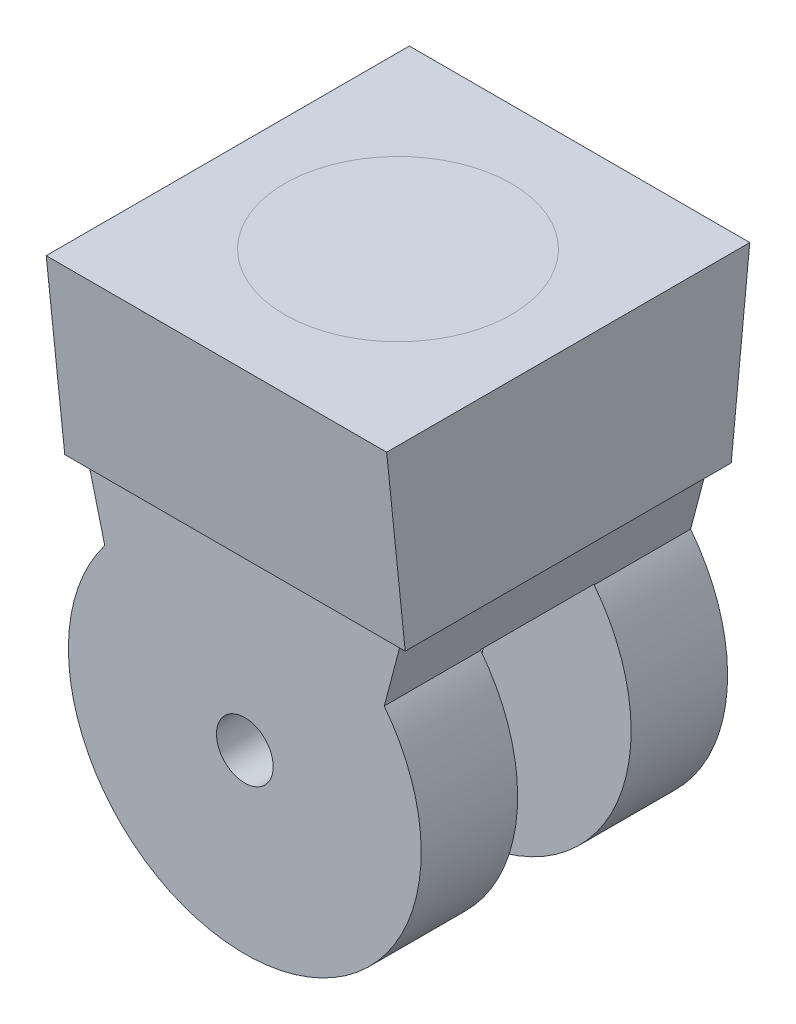
ISO-10303-21;
HEADER;
FILE_DESCRIPTION(('STEP AP214'),'2;1');
FILE_NAME('part.step','',(''),(''),'','','');
FILE_SCHEMA(('AUTOMOTIVE_DESIGN { 1 0 10303 214 1 1 1 1 }'));
ENDSEC;
DATA;
#1=APPLICATION_CONTEXT('core data for automotive mechanical design processes');
#2=APPLICATION_PROTOCOL_DEFINITION('international standard','automotive_design',2000,#1);
#3=PRODUCT_CONTEXT('',#1,'mechanical');
#4=PRODUCT('Part','Part','',(#3));
#5=PRODUCT_RELATED_PRODUCT_CATEGORY('part','',(#4));
#6=PRODUCT_DEFINITION_FORMATION('','',#4);
#7=PRODUCT_DEFINITION_CONTEXT('part definition',#1,'design');
#8=PRODUCT_DEFINITION('design','',#6,#7);
#9=PRODUCT_DEFINITION_SHAPE('','',#8);
#10=(LENGTH_UNIT() NAMED_UNIT(*) SI_UNIT(.MILLI.,.METRE.));
#11=(NAMED_UNIT(*) PLANE_ANGLE_UNIT() SI_UNIT($,.RADIAN.));
#12=(NAMED_UNIT(*) SI_UNIT($,.STERADIAN.) SOLID_ANGLE_UNIT());
#13=UNCERTAINTY_MEASURE_WITH_UNIT(LENGTH_MEASURE(1.E-05),#10,'distance_accuracy_value','');
#14=(GEOMETRIC_REPRESENTATION_CONTEXT(3) GLOBAL_UNCERTAINTY_ASSIGNED_CONTEXT((#13)) GLOBAL_UNIT_ASSIGNED_CONTEXT((#10,
#11,#12)) REPRESENTATION_CONTEXT('',''));
#15=CARTESIAN_POINT('',(0.,0.,0.));
#16=DIRECTION('',(0.,0.,1.));
#17=DIRECTION('',(1.,0.,0.));
#18=AXIS2_PLACEMENT_3D('',#15,#16,#17);
#19=CARTESIAN_POINT('',(38.1,20.319999994927,40.64));
#20=DIRECTION('',(0.,-1.,0.));
#21=DIRECTION('',(0.,0.,-1.));
#22=AXIS2_PLACEMENT_3D('',#19,#20,#21);
#23=PLANE('',#22);
#24=DIRECTION('',(0.,0.,1.));
#25=VECTOR('',#24,1.);
#26=CARTESIAN_POINT('',(-38.1,20.319999994927,40.64));
#27=LINE('',#26,#25);
#28=CARTESIAN_POINT('',(-38.1,20.319999994927,-40.64));
#29=VERTEX_POINT('',#28);
#30=CARTESIAN_POINT('',(-38.1,20.319999994927,40.64));
#31=VERTEX_POINT('',#30);
#32=EDGE_CURVE('E225',#29,#31,#27,.T.);
#33=ORIENTED_EDGE('',*,*,#32,.T.);
#34=DIRECTION('',(-1.,0.,0.));
#35=VECTOR('',#34,1.);
#36=CARTESIAN_POINT('',(38.1,20.319999994927,40.64));
#37=LINE('',#36,#35);
#38=CARTESIAN_POINT('',(38.1,20.319999994927,40.64));
#39=VERTEX_POINT('',#38);
#40=EDGE_CURVE('E236',#39,#31,#37,.T.);
#41=ORIENTED_EDGE('',*,*,#40,.F.);
#42=DIRECTION('',(0.,0.,1.));
#43=VECTOR('',#42,1.);
#44=CARTESIAN_POINT('',(38.1,20.319999994927,40.64));
#45=LINE('',#44,#43);
#46=CARTESIAN_POINT('',(38.1,20.319999994927,-40.64));
#47=VERTEX_POINT('',#46);
#48=EDGE_CURVE('E215',#47,#39,#45,.T.);
#49=ORIENTED_EDGE('',*,*,#48,.F.);
#50=DIRECTION('',(-1.,0.,0.));
#51=VECTOR('',#50,1.);
#52=CARTESIAN_POINT('',(38.1,20.319999994927,-40.64));
#53=LINE('',#52,#51);
#54=EDGE_CURVE('E240',#47,#29,#53,.T.);
#55=ORIENTED_EDGE('',*,*,#54,.T.);
#56=EDGE_LOOP('',(#33,#41,#49,#55));
#57=FACE_BOUND('',#56,.T.);
#58=CARTESIAN_POINT('',(0.,20.319999994927,0.));
#59=DIRECTION('',(0.,-1.,0.));
#60=DIRECTION('',(0.,0.,-1.));
#61=AXIS2_PLACEMENT_3D('',#58,#59,#60);
#62=CIRCLE('',#61,25.4);
#63=CARTESIAN_POINT('',(0.,20.319999994927,-25.4));
#64=VERTEX_POINT('',#63);
#65=EDGE_CURVE('E11',#64,#64,#62,.F.);
#66=ORIENTED_EDGE('',*,*,#65,.F.);
#67=EDGE_LOOP('',(#66));
#68=FACE_BOUND('',#67,.T.);
#69=ADVANCED_FACE('F42',(#57,#68),#23,.F.);
#70=CARTESIAN_POINT('',(-35.2236647465318,-20.319999994927,34.29));
#71=DIRECTION('',(0.969652768454366,0.244486213576111,0.));
#72=DIRECTION('',(-0.244486213576111,0.969652768454366,0.));
#73=AXIS2_PLACEMENT_3D('',#70,#71,#72);
#74=PLANE('',#73);
#75=DIRECTION('',(0.244486213576111,-0.969652768454366,0.));
#76=VECTOR('',#75,1.);
#77=CARTESIAN_POINT('',(-35.2236647465318,-20.319999994927,-12.7));
#78=LINE('',#77,#76);
#79=CARTESIAN_POINT('',(-31.4038208646109,-35.4698202690057,-12.7));
#80=VERTEX_POINT('',#79);
#81=CARTESIAN_POINT('',(-31.3489203017592,-35.6875604923914,-12.7));
#82=VERTEX_POINT('',#81);
#83=EDGE_CURVE('E156',#80,#82,#78,.T.);
#84=ORIENTED_EDGE('',*,*,#83,.F.);
#85=DIRECTION('',(0.,0.,1.));
#86=VECTOR('',#85,1.);
#87=CARTESIAN_POINT('',(-31.4038208646109,-35.4698202690057,-12.7));
#88=LINE('',#87,#86);
#89=CARTESIAN_POINT('',(-31.4038208646109,-35.4698202690057,12.7));
#90=VERTEX_POINT('',#89);
#91=EDGE_CURVE('E144',#80,#90,#88,.T.);
#92=ORIENTED_EDGE('',*,*,#91,.T.);
#93=DIRECTION('',(0.244486213576111,-0.969652768454366,0.));
#94=VECTOR('',#93,1.);
#95=CARTESIAN_POINT('',(-35.2236647465318,-20.319999994927,12.7));
#96=LINE('',#95,#94);
#97=CARTESIAN_POINT('',(-31.3489203017592,-35.6875604923914,12.7));
#98=VERTEX_POINT('',#97);
#99=EDGE_CURVE('E130',#90,#98,#96,.T.);
#100=ORIENTED_EDGE('',*,*,#99,.T.);
#101=DIRECTION('',(0.,0.,-1.));
#102=VECTOR('',#101,1.);
#103=CARTESIAN_POINT('',(-31.3489203017592,-35.6875604923914,34.29));
#104=LINE('',#103,#102);
#105=CARTESIAN_POINT('',(-31.3489203017592,-35.6875604923914,34.29));
#106=VERTEX_POINT('',#105);
#107=EDGE_CURVE('E203',#106,#98,#104,.T.);
#108=ORIENTED_EDGE('',*,*,#107,.F.);
#109=DIRECTION('',(0.244486213576111,-0.969652768454366,0.));
#110=VECTOR('',#109,1.);
#111=CARTESIAN_POINT('',(-35.2236647465318,-20.319999994927,34.29));
#112=LINE('',#111,#110);
#113=CARTESIAN_POINT('',(-35.2236647465318,-20.319999994927,34.29));
#114=VERTEX_POINT('',#113);
#115=EDGE_CURVE('E168',#114,#106,#112,.T.);
#116=ORIENTED_EDGE('',*,*,#115,.F.);
#117=DIRECTION('',(0.,0.,-1.));
#118=VECTOR('',#117,1.);
#119=CARTESIAN_POINT('',(-35.2236647465318,-20.319999994927,34.29));
#120=LINE('',#119,#118);
#121=CARTESIAN_POINT('',(-35.2236647465318,-20.319999994927,-34.29));
#122=VERTEX_POINT('',#121);
#123=EDGE_CURVE('E66',#114,#122,#120,.T.);
#124=ORIENTED_EDGE('',*,*,#123,.T.);
#125=DIRECTION('',(0.244486213576111,-0.969652768454366,0.));
#126=VECTOR('',#125,1.);
#127=CARTESIAN_POINT('',(-35.2236647465318,-20.319999994927,-34.29));
#128=LINE('',#127,#126);
#129=CARTESIAN_POINT('',(-31.3489203017592,-35.6875604923914,-34.29));
#130=VERTEX_POINT('',#129);
#131=EDGE_CURVE('E158',#122,#130,#128,.T.);
#132=ORIENTED_EDGE('',*,*,#131,.T.);
#133=EDGE_CURVE('E202',#82,#130,#104,.T.);
#134=ORIENTED_EDGE('',*,*,#133,.F.);
#135=EDGE_LOOP('',(#84,#92,#100,#108,#116,#124,#132,#134));
#136=FACE_BOUND('',#135,.T.);
#137=ADVANCED_FACE('F154',(#136),#74,.F.);
#138=CARTESIAN_POINT('',(0.,-59.689999994927,34.29));
#139=DIRECTION('',(0.,0.,-1.));
#140=DIRECTION('',(-1.,0.,0.));
#141=AXIS2_PLACEMENT_3D('',#138,#139,#140);
#142=CYLINDRICAL_SURFACE('',#141,39.4825519205501);
#143=CARTESIAN_POINT('',(0.,-59.689999994927,-12.7));
#144=DIRECTION('',(0.,0.,1.));
#145=DIRECTION('',(1.,0.,0.));
#146=AXIS2_PLACEMENT_3D('',#143,#144,#145);
#147=CIRCLE('',#146,39.4825519205501);
#148=CARTESIAN_POINT('',(31.2096354471804,-35.5067297153921,-12.7));
#149=VERTEX_POINT('',#148);
#150=EDGE_CURVE('E139',#82,#149,#147,.T.);
#151=ORIENTED_EDGE('',*,*,#150,.F.);
#152=ORIENTED_EDGE('',*,*,#133,.T.);
#153=CARTESIAN_POINT('',(0.,-59.689999994927,-34.29));
#154=DIRECTION('',(0.,0.,1.));
#155=DIRECTION('',(1.,0.,0.));
#156=AXIS2_PLACEMENT_3D('',#153,#154,#155);
#157=CIRCLE('',#156,39.4825519205501);
#158=CARTESIAN_POINT('',(31.2096354471804,-35.5067297153921,-34.29));
#159=VERTEX_POINT('',#158);
#160=EDGE_CURVE('E163',#130,#159,#157,.T.);
#161=ORIENTED_EDGE('',*,*,#160,.T.);
#162=DIRECTION('',(0.,0.,-1.));
#163=VECTOR('',#162,1.);
#164=CARTESIAN_POINT('',(31.2096354471804,-35.5067297153921,34.29));
#165=LINE('',#164,#163);
#166=EDGE_CURVE('E197',#149,#159,#165,.T.);
#167=ORIENTED_EDGE('',*,*,#166,.F.);
#168=EDGE_LOOP('',(#151,#152,#161,#167));
#169=FACE_BOUND('',#168,.T.);
#170=ADVANCED_FACE('F285',(#169),#142,.T.);
#171=CARTESIAN_POINT('',(35.2236647465318,-20.319999994927,34.29));
#172=DIRECTION('',(-0.966799451339229,0.255536339666524,0.));
#173=DIRECTION('',(-0.255536339666524,-0.966799451339229,0.));
#174=AXIS2_PLACEMENT_3D('',#171,#172,#173);
#175=PLANE('',#174);
#176=DIRECTION('',(0.255536339666524,0.966799451339229,0.));
#177=VECTOR('',#176,1.);
#178=CARTESIAN_POINT('',(35.2236647465318,-20.319999994927,-12.7));
#179=LINE('',#178,#177);
#180=CARTESIAN_POINT('',(31.2662593471183,-35.2924981291369,-12.7));
#181=VERTEX_POINT('',#180);
#182=EDGE_CURVE('E51',#149,#181,#179,.T.);
#183=ORIENTED_EDGE('',*,*,#182,.F.);
#184=ORIENTED_EDGE('',*,*,#166,.T.);
#185=DIRECTION('',(0.255536339666524,0.966799451339229,0.));
#186=VECTOR('',#185,1.);
#187=CARTESIAN_POINT('',(35.2236647465318,-20.319999994927,-34.29));
#188=LINE('',#187,#186);
#189=CARTESIAN_POINT('',(35.2236647465318,-20.319999994927,-34.29));
#190=VERTEX_POINT('',#189);
#191=EDGE_CURVE('E186',#159,#190,#188,.T.);
#192=ORIENTED_EDGE('',*,*,#191,.T.);
#193=DIRECTION('',(0.,0.,-1.));
#194=VECTOR('',#193,1.);
#195=CARTESIAN_POINT('',(35.2236647465318,-20.319999994927,34.29));
#196=LINE('',#195,#194);
#197=CARTESIAN_POINT('',(35.2236647465318,-20.319999994927,34.29));
#198=VERTEX_POINT('',#197);
#199=EDGE_CURVE('E194',#198,#190,#196,.T.);
#200=ORIENTED_EDGE('',*,*,#199,.F.);
#201=DIRECTION('',(0.255536339666524,0.966799451339229,0.));
#202=VECTOR('',#201,1.);
#203=CARTESIAN_POINT('',(35.2236647465318,-20.319999994927,34.29));
#204=LINE('',#203,#202);
#205=CARTESIAN_POINT('',(31.2096354471804,-35.5067297153921,34.29));
#206=VERTEX_POINT('',#205);
#207=EDGE_CURVE('E176',#206,#198,#204,.T.);
#208=ORIENTED_EDGE('',*,*,#207,.F.);
#209=CARTESIAN_POINT('',(31.2096354471804,-35.5067297153921,12.7));
#210=VERTEX_POINT('',#209);
#211=EDGE_CURVE('E198',#206,#210,#165,.T.);
#212=ORIENTED_EDGE('',*,*,#211,.T.);
#213=DIRECTION('',(0.255536339666524,0.966799451339229,0.));
#214=VECTOR('',#213,1.);
#215=CARTESIAN_POINT('',(35.2236647465318,-20.319999994927,12.7));
#216=LINE('',#215,#214);
#217=CARTESIAN_POINT('',(31.2662593471183,-35.2924981291369,12.7));
#218=VERTEX_POINT('',#217);
#219=EDGE_CURVE('E248',#210,#218,#216,.T.);
#220=ORIENTED_EDGE('',*,*,#219,.T.);
#221=DIRECTION('',(0.,0.,1.));
#222=VECTOR('',#221,1.);
#223=CARTESIAN_POINT('',(31.2662593471183,-35.2924981291369,-12.7));
#224=LINE('',#223,#222);
#225=EDGE_CURVE('E147',#218,#181,#224,.F.);
#226=ORIENTED_EDGE('',*,*,#225,.T.);
#227=EDGE_LOOP('',(#183,#184,#192,#200,#208,#212,#220,#226));
#228=FACE_BOUND('',#227,.T.);
#229=ADVANCED_FACE('F284',(#228),#175,.F.);
#230=CARTESIAN_POINT('',(38.1,20.319999994927,-40.64));
#231=DIRECTION('',(0.,0.101681793550419,0.994816974553797));
#232=DIRECTION('',(0.,-0.994816974553797,0.101681793550419));
#233=AXIS2_PLACEMENT_3D('',#230,#231,#232);
#234=PLANE('',#233);
#235=DIRECTION('',(0.,0.994816974553797,-0.101681793550419));
#236=VECTOR('',#235,1.);
#237=CARTESIAN_POINT('',(-38.1,20.319999994927,-40.64));
#238=LINE('',#237,#236);
#239=CARTESIAN_POINT('',(-38.1,-20.319999994927,-36.4861222571008));
#240=VERTEX_POINT('',#239);
#241=EDGE_CURVE('E206',#240,#29,#238,.T.);
#242=ORIENTED_EDGE('',*,*,#241,.T.);
#243=ORIENTED_EDGE('',*,*,#54,.F.);
#244=DIRECTION('',(0.,0.994816974553797,-0.101681793550419));
#245=VECTOR('',#244,1.);
#246=CARTESIAN_POINT('',(38.1,20.319999994927,-40.64));
#247=LINE('',#246,#245);
#248=CARTESIAN_POINT('',(38.1,-20.319999994927,-36.4861222571008));
#249=VERTEX_POINT('',#248);
#250=EDGE_CURVE('E211',#249,#47,#247,.T.);
#251=ORIENTED_EDGE('',*,*,#250,.F.);
#252=DIRECTION('',(-1.,0.,0.));
#253=VECTOR('',#252,1.);
#254=CARTESIAN_POINT('',(38.1,-20.319999994927,-36.4861222571008));
#255=LINE('',#254,#253);
#256=EDGE_CURVE('E244',#249,#240,#255,.T.);
#257=ORIENTED_EDGE('',*,*,#256,.T.);
#258=EDGE_LOOP('',(#242,#243,#251,#257));
#259=FACE_BOUND('',#258,.T.);
#260=ADVANCED_FACE('F44',(#259),#234,.F.);
#261=ORIENTED_EDGE('',*,*,#65,.T.);
#262=EDGE_LOOP('',(#261));
#263=FACE_BOUND('',#262,.T.);
#264=ADVANCED_FACE('F324',(#263),#23,.F.);
#265=CARTESIAN_POINT('',(38.1,20.319999994927,40.64));
#266=DIRECTION('',(0.,0.101681793550419,-0.994816974553797));
#267=DIRECTION('',(0.,0.994816974553797,0.101681793550419));
#268=AXIS2_PLACEMENT_3D('',#265,#266,#267);
#269=PLANE('',#268);
#270=DIRECTION('',(0.,-0.994816974553797,-0.101681793550419));
#271=VECTOR('',#270,1.);
#272=CARTESIAN_POINT('',(-38.1,20.319999994927,40.64));
#273=LINE('',#272,#271);
#274=CARTESIAN_POINT('',(-38.1,-20.319999994927,36.4861222571008));
#275=VERTEX_POINT('',#274);
#276=EDGE_CURVE('E228',#31,#275,#273,.T.);
#277=ORIENTED_EDGE('',*,*,#276,.T.);
#278=DIRECTION('',(-1.,0.,0.));
#279=VECTOR('',#278,1.);
#280=CARTESIAN_POINT('',(38.1,-20.319999994927,36.4861222571008));
#281=LINE('',#280,#279);
#282=CARTESIAN_POINT('',(38.1,-20.319999994927,36.4861222571008));
#283=VERTEX_POINT('',#282);
#284=EDGE_CURVE('E222',#283,#275,#281,.T.);
#285=ORIENTED_EDGE('',*,*,#284,.F.);
#286=DIRECTION('',(0.,-0.994816974553797,-0.101681793550419));
#287=VECTOR('',#286,1.);
#288=CARTESIAN_POINT('',(38.1,20.319999994927,40.64));
#289=LINE('',#288,#287);
#290=EDGE_CURVE('E218',#39,#283,#289,.T.);
#291=ORIENTED_EDGE('',*,*,#290,.F.);
#292=ORIENTED_EDGE('',*,*,#40,.T.);
#293=EDGE_LOOP('',(#277,#285,#291,#292));
#294=FACE_BOUND('',#293,.T.);
#295=ADVANCED_FACE('F331',(#294),#269,.F.);
#296=CARTESIAN_POINT('',(38.1,-20.319999994927,36.4861222571008));
#297=DIRECTION('',(0.,1.,0.));
#298=DIRECTION('',(0.,0.,1.));
#299=AXIS2_PLACEMENT_3D('',#296,#297,#298);
#300=PLANE('',#299);
#301=ORIENTED_EDGE('',*,*,#123,.F.);
#302=DIRECTION('',(-1.,0.,0.));
#303=VECTOR('',#302,1.);
#304=CARTESIAN_POINT('',(-35.2236647465318,-20.319999994927,34.29));
#305=LINE('',#304,#303);
#306=EDGE_CURVE('E180',#198,#114,#305,.T.);
#307=ORIENTED_EDGE('',*,*,#306,.F.);
#308=ORIENTED_EDGE('',*,*,#199,.T.);
#309=DIRECTION('',(-1.,0.,0.));
#310=VECTOR('',#309,1.);
#311=CARTESIAN_POINT('',(-35.2236647465318,-20.319999994927,-34.29));
#312=LINE('',#311,#310);
#313=EDGE_CURVE('E173',#190,#122,#312,.T.);
#314=ORIENTED_EDGE('',*,*,#313,.T.);
#315=EDGE_LOOP('',(#301,#307,#308,#314));
#316=FACE_BOUND('',#315,.T.);
#317=DIRECTION('',(0.,0.,-1.));
#318=VECTOR('',#317,1.);
#319=CARTESIAN_POINT('',(-38.1,-20.319999994927,36.4861222571008));
#320=LINE('',#319,#318);
#321=EDGE_CURVE('E212',#275,#240,#320,.T.);
#322=ORIENTED_EDGE('',*,*,#321,.T.);
#323=ORIENTED_EDGE('',*,*,#256,.F.);
#324=DIRECTION('',(0.,0.,-1.));
#325=VECTOR('',#324,1.);
#326=CARTESIAN_POINT('',(38.1,-20.319999994927,-36.4861222571008));
#327=LINE('',#326,#325);
#328=EDGE_CURVE('E207',#283,#249,#327,.T.);
#329=ORIENTED_EDGE('',*,*,#328,.F.);
#330=ORIENTED_EDGE('',*,*,#284,.T.);
#331=EDGE_LOOP('',(#322,#323,#329,#330));
#332=FACE_BOUND('',#331,.T.);
#333=ADVANCED_FACE('F303',(#316,#332),#300,.F.);
#334=CARTESIAN_POINT('',(38.1,0.,0.));
#335=DIRECTION('',(1.,0.,0.));
#336=DIRECTION('',(0.,0.,-1.));
#337=AXIS2_PLACEMENT_3D('',#334,#335,#336);
#338=PLANE('',#337);
#339=ORIENTED_EDGE('',*,*,#328,.T.);
#340=ORIENTED_EDGE('',*,*,#250,.T.);
#341=ORIENTED_EDGE('',*,*,#48,.T.);
#342=ORIENTED_EDGE('',*,*,#290,.T.);
#343=EDGE_LOOP('',(#339,#340,#341,#342));
#344=FACE_BOUND('',#343,.T.);
#345=ADVANCED_FACE('F316',(#344),#338,.T.);
#346=CARTESIAN_POINT('',(-38.1,0.,0.));
#347=DIRECTION('',(1.,0.,0.));
#348=DIRECTION('',(0.,0.,-1.));
#349=AXIS2_PLACEMENT_3D('',#346,#347,#348);
#350=PLANE('',#349);
#351=ORIENTED_EDGE('',*,*,#241,.F.);
#352=ORIENTED_EDGE('',*,*,#321,.F.);
#353=ORIENTED_EDGE('',*,*,#276,.F.);
#354=ORIENTED_EDGE('',*,*,#32,.F.);
#355=EDGE_LOOP('',(#351,#352,#353,#354));
#356=FACE_BOUND('',#355,.T.);
#357=ADVANCED_FACE('F308',(#356),#350,.F.);
#358=ORIENTED_EDGE('',*,*,#107,.T.);
#359=CARTESIAN_POINT('',(0.,-59.689999994927,12.7));
#360=DIRECTION('',(0.,0.,1.));
#361=DIRECTION('',(1.,0.,0.));
#362=AXIS2_PLACEMENT_3D('',#359,#360,#361);
#363=CIRCLE('',#362,39.4825519205501);
#364=EDGE_CURVE('E133',#98,#210,#363,.T.);
#365=ORIENTED_EDGE('',*,*,#364,.T.);
#366=ORIENTED_EDGE('',*,*,#211,.F.);
#367=CARTESIAN_POINT('',(0.,-59.689999994927,34.29));
#368=DIRECTION('',(0.,0.,1.));
#369=DIRECTION('',(1.,0.,0.));
#370=AXIS2_PLACEMENT_3D('',#367,#368,#369);
#371=CIRCLE('',#370,39.4825519205501);
#372=EDGE_CURVE('E172',#106,#206,#371,.T.);
#373=ORIENTED_EDGE('',*,*,#372,.F.);
#374=EDGE_LOOP('',(#358,#365,#366,#373));
#375=FACE_BOUND('',#374,.T.);
#376=ADVANCED_FACE('F306',(#375),#142,.T.);
#377=CARTESIAN_POINT('',(0.,-59.689999994927,34.29));
#378=DIRECTION('',(0.,0.,1.));
#379=DIRECTION('',(1.,0.,0.));
#380=AXIS2_PLACEMENT_3D('',#377,#378,#379);
#381=PLANE('',#380);
#382=CARTESIAN_POINT('',(0.,-59.689999994927,34.29));
#383=DIRECTION('',(0.,0.,1.));
#384=DIRECTION('',(1.,0.,0.));
#385=AXIS2_PLACEMENT_3D('',#382,#383,#384);
#386=CIRCLE('',#385,6.35);
#387=CARTESIAN_POINT('',(6.35000000000001,-59.689999994927,34.29));
#388=VERTEX_POINT('',#387);
#389=EDGE_CURVE('E258',#388,#388,#386,.T.);
#390=ORIENTED_EDGE('',*,*,#389,.F.);
#391=EDGE_LOOP('',(#390));
#392=FACE_BOUND('',#391,.T.);
#393=ORIENTED_EDGE('',*,*,#115,.T.);
#394=ORIENTED_EDGE('',*,*,#372,.T.);
#395=ORIENTED_EDGE('',*,*,#207,.T.);
#396=ORIENTED_EDGE('',*,*,#306,.T.);
#397=EDGE_LOOP('',(#393,#394,#395,#396));
#398=FACE_BOUND('',#397,.T.);
#399=ADVANCED_FACE('F299',(#392,#398),#381,.T.);
#400=CARTESIAN_POINT('',(0.,-59.689999994927,-34.29));
#401=DIRECTION('',(0.,0.,1.));
#402=DIRECTION('',(1.,0.,0.));
#403=AXIS2_PLACEMENT_3D('',#400,#401,#402);
#404=PLANE('',#403);
#405=CARTESIAN_POINT('',(0.,-59.689999994927,-34.29));
#406=DIRECTION('',(0.,0.,1.));
#407=DIRECTION('',(1.,0.,0.));
#408=AXIS2_PLACEMENT_3D('',#405,#406,#407);
#409=CIRCLE('',#408,6.35);
#410=CARTESIAN_POINT('',(6.35000000000001,-59.689999994927,-34.29));
#411=VERTEX_POINT('',#410);
#412=EDGE_CURVE('E151',#411,#411,#409,.T.);
#413=ORIENTED_EDGE('',*,*,#412,.T.);
#414=EDGE_LOOP('',(#413));
#415=FACE_BOUND('',#414,.T.);
#416=ORIENTED_EDGE('',*,*,#131,.F.);
#417=ORIENTED_EDGE('',*,*,#313,.F.);
#418=ORIENTED_EDGE('',*,*,#191,.F.);
#419=ORIENTED_EDGE('',*,*,#160,.F.);
#420=EDGE_LOOP('',(#416,#417,#418,#419));
#421=FACE_BOUND('',#420,.T.);
#422=ADVANCED_FACE('F295',(#415,#421),#404,.F.);
#423=CARTESIAN_POINT('',(0.,-59.689999994927,-12.7));
#424=DIRECTION('',(0.,0.,1.));
#425=DIRECTION('',(1.,0.,0.));
#426=AXIS2_PLACEMENT_3D('',#423,#424,#425);
#427=CYLINDRICAL_SURFACE('',#426,39.6587578077339);
#428=CARTESIAN_POINT('',(0.,-59.689999994927,-12.7));
#429=DIRECTION('',(0.,0.,1.));
#430=DIRECTION('',(1.,0.,0.));
#431=AXIS2_PLACEMENT_3D('',#428,#429,#430);
#432=CIRCLE('',#431,39.6587578077339);
#433=EDGE_CURVE('E150',#181,#80,#432,.T.);
#434=ORIENTED_EDGE('',*,*,#433,.F.);
#435=ORIENTED_EDGE('',*,*,#225,.F.);
#436=CARTESIAN_POINT('',(0.,-59.689999994927,12.7));
#437=DIRECTION('',(0.,0.,1.));
#438=DIRECTION('',(1.,0.,0.));
#439=AXIS2_PLACEMENT_3D('',#436,#437,#438);
#440=CIRCLE('',#439,39.6587578077339);
#441=EDGE_CURVE('E58',#218,#90,#440,.T.);
#442=ORIENTED_EDGE('',*,*,#441,.T.);
#443=ORIENTED_EDGE('',*,*,#91,.F.);
#444=EDGE_LOOP('',(#434,#435,#442,#443));
#445=FACE_BOUND('',#444,.T.);
#446=ADVANCED_FACE('F143',(#445),#427,.F.);
#447=CARTESIAN_POINT('',(0.,-59.689999994927,-12.7));
#448=DIRECTION('',(0.,0.,1.));
#449=DIRECTION('',(1.,0.,0.));
#450=AXIS2_PLACEMENT_3D('',#447,#448,#449);
#451=PLANE('',#450);
#452=CARTESIAN_POINT('',(0.,-59.689999994927,-12.7));
#453=DIRECTION('',(0.,0.,1.));
#454=DIRECTION('',(1.,0.,0.));
#455=AXIS2_PLACEMENT_3D('',#452,#453,#454);
#456=CIRCLE('',#455,6.35);
#457=CARTESIAN_POINT('',(6.35000000000001,-59.689999994927,-12.7));
#458=VERTEX_POINT('',#457);
#459=EDGE_CURVE('E257',#458,#458,#456,.T.);
#460=ORIENTED_EDGE('',*,*,#459,.F.);
#461=EDGE_LOOP('',(#460));
#462=FACE_BOUND('',#461,.T.);
#463=ORIENTED_EDGE('',*,*,#83,.T.);
#464=ORIENTED_EDGE('',*,*,#150,.T.);
#465=ORIENTED_EDGE('',*,*,#182,.T.);
#466=ORIENTED_EDGE('',*,*,#433,.T.);
#467=EDGE_LOOP('',(#463,#464,#465,#466));
#468=FACE_BOUND('',#467,.T.);
#469=ADVANCED_FACE('F280',(#462,#468),#451,.T.);
#470=CARTESIAN_POINT('',(0.,-59.689999994927,12.7));
#471=DIRECTION('',(0.,0.,1.));
#472=DIRECTION('',(1.,0.,0.));
#473=AXIS2_PLACEMENT_3D('',#470,#471,#472);
#474=PLANE('',#473);
#475=CARTESIAN_POINT('',(0.,-59.689999994927,12.7));
#476=DIRECTION('',(0.,0.,1.));
#477=DIRECTION('',(1.,0.,0.));
#478=AXIS2_PLACEMENT_3D('',#475,#476,#477);
#479=CIRCLE('',#478,6.35);
#480=CARTESIAN_POINT('',(6.35000000000001,-59.689999994927,12.7));
#481=VERTEX_POINT('',#480);
#482=EDGE_CURVE('E254',#481,#481,#479,.T.);
#483=ORIENTED_EDGE('',*,*,#482,.T.);
#484=EDGE_LOOP('',(#483));
#485=FACE_BOUND('',#484,.T.);
#486=ORIENTED_EDGE('',*,*,#441,.F.);
#487=ORIENTED_EDGE('',*,*,#219,.F.);
#488=ORIENTED_EDGE('',*,*,#364,.F.);
#489=ORIENTED_EDGE('',*,*,#99,.F.);
#490=EDGE_LOOP('',(#486,#487,#488,#489));
#491=FACE_BOUND('',#490,.T.);
#492=ADVANCED_FACE('F131',(#485,#491),#474,.F.);
#493=CARTESIAN_POINT('',(0.,-59.689999994927,-40.64));
#494=DIRECTION('',(0.,0.,1.));
#495=DIRECTION('',(1.,0.,0.));
#496=AXIS2_PLACEMENT_3D('',#493,#494,#495);
#497=CYLINDRICAL_SURFACE('',#496,6.35);
#498=ORIENTED_EDGE('',*,*,#389,.T.);
#499=EDGE_LOOP('',(#498));
#500=FACE_BOUND('',#499,.T.);
#501=ORIENTED_EDGE('',*,*,#482,.F.);
#502=EDGE_LOOP('',(#501));
#503=FACE_BOUND('',#502,.T.);
#504=ADVANCED_FACE('F436',(#500,#503),#497,.F.);
#505=ORIENTED_EDGE('',*,*,#459,.T.);
#506=EDGE_LOOP('',(#505));
#507=FACE_BOUND('',#506,.T.);
#508=ORIENTED_EDGE('',*,*,#412,.F.);
#509=EDGE_LOOP('',(#508));
#510=FACE_BOUND('',#509,.T.);
#511=ADVANCED_FACE('F444',(#507,#510),#497,.F.);
#512=CLOSED_SHELL('',(#69,#137,#170,#229,#260,#264,#295,#333,#345,#357,#376,#399,#422,#446,#469,
#492,#504,#511));
#513=MANIFOLD_SOLID_BREP('B2',#512);
#514=ADVANCED_BREP_SHAPE_REPRESENTATION('',(#18,#513),#14);
#515=SHAPE_DEFINITION_REPRESENTATION(#9,#514);
ENDSEC;
END-ISO-10303-21;
